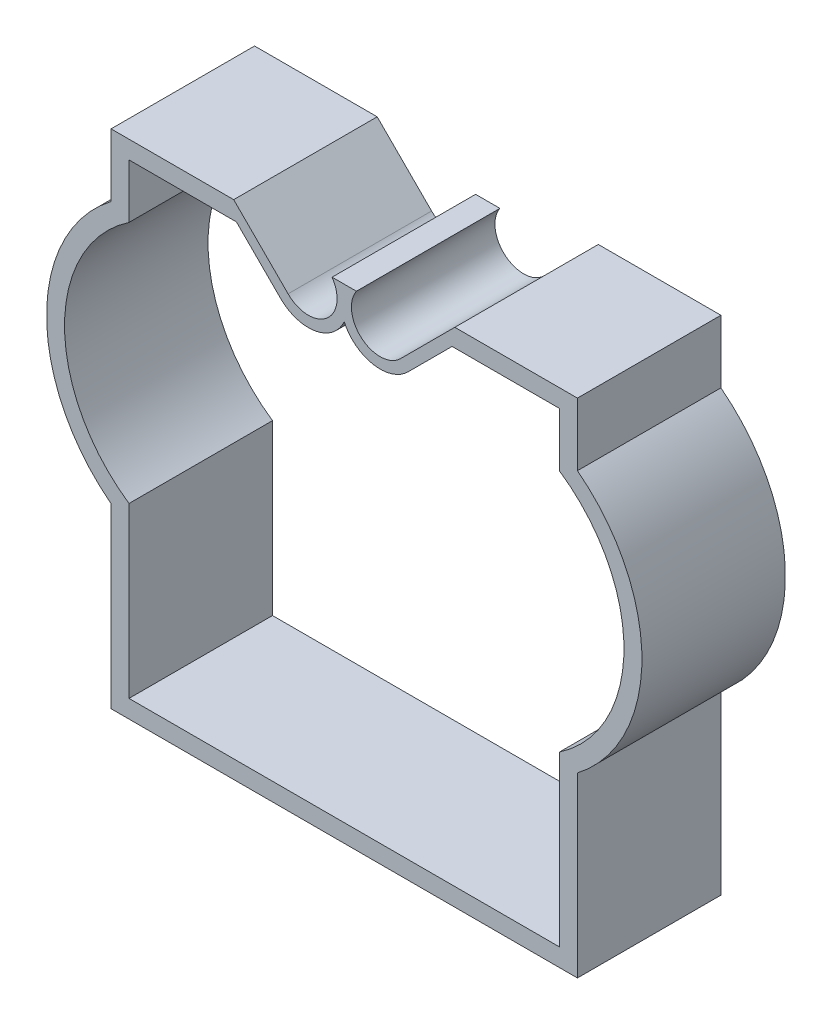
ISO-10303-21;
HEADER;
FILE_DESCRIPTION(('STEP AP214'),'2;1');
FILE_NAME('part.step','',(''),(''),'','','');
FILE_SCHEMA(('AUTOMOTIVE_DESIGN { 1 0 10303 214 1 1 1 1 }'));
ENDSEC;
DATA;
#1=APPLICATION_CONTEXT('core data for automotive mechanical design processes');
#2=APPLICATION_PROTOCOL_DEFINITION('international standard','automotive_design',2000,#1);
#3=PRODUCT_CONTEXT('',#1,'mechanical');
#4=PRODUCT('Part','Part','',(#3));
#5=PRODUCT_RELATED_PRODUCT_CATEGORY('part','',(#4));
#6=PRODUCT_DEFINITION_FORMATION('','',#4);
#7=PRODUCT_DEFINITION_CONTEXT('part definition',#1,'design');
#8=PRODUCT_DEFINITION('design','',#6,#7);
#9=PRODUCT_DEFINITION_SHAPE('','',#8);
#10=(LENGTH_UNIT() NAMED_UNIT(*) SI_UNIT(.MILLI.,.METRE.));
#11=(NAMED_UNIT(*) PLANE_ANGLE_UNIT() SI_UNIT($,.RADIAN.));
#12=(NAMED_UNIT(*) SI_UNIT($,.STERADIAN.) SOLID_ANGLE_UNIT());
#13=UNCERTAINTY_MEASURE_WITH_UNIT(LENGTH_MEASURE(1.E-05),#10,'distance_accuracy_value','');
#14=(GEOMETRIC_REPRESENTATION_CONTEXT(3) GLOBAL_UNCERTAINTY_ASSIGNED_CONTEXT((#13)) GLOBAL_UNIT_ASSIGNED_CONTEXT((#10,
#11,#12)) REPRESENTATION_CONTEXT('',''));
#15=CARTESIAN_POINT('',(0.,0.,0.));
#16=DIRECTION('',(0.,0.,1.));
#17=DIRECTION('',(1.,0.,0.));
#18=AXIS2_PLACEMENT_3D('',#15,#16,#17);
#19=CARTESIAN_POINT('',(0.,32.5,20.));
#20=DIRECTION('',(0.,1.,0.));
#21=DIRECTION('',(-1.,0.,0.));
#22=AXIS2_PLACEMENT_3D('',#19,#20,#21);
#23=PLANE('',#22);
#24=DIRECTION('',(1.,0.,0.));
#25=VECTOR('',#24,1.);
#26=CARTESIAN_POINT('',(0.,32.5,0.));
#27=LINE('',#26,#25);
#28=CARTESIAN_POINT('',(15.0311058469958,32.5,0.));
#29=VERTEX_POINT('',#28);
#30=CARTESIAN_POINT('',(30.,32.5,0.));
#31=VERTEX_POINT('',#30);
#32=EDGE_CURVE('E293',#29,#31,#27,.T.);
#33=ORIENTED_EDGE('',*,*,#32,.T.);
#34=DIRECTION('',(0.,0.,-1.));
#35=VECTOR('',#34,1.);
#36=CARTESIAN_POINT('',(30.,32.5,20.));
#37=LINE('',#36,#35);
#38=CARTESIAN_POINT('',(30.,32.5,20.));
#39=VERTEX_POINT('',#38);
#40=EDGE_CURVE('E11',#39,#31,#37,.T.);
#41=ORIENTED_EDGE('',*,*,#40,.F.);
#42=DIRECTION('',(1.,0.,0.));
#43=VECTOR('',#42,1.);
#44=CARTESIAN_POINT('',(0.,32.5,20.));
#45=LINE('',#44,#43);
#46=CARTESIAN_POINT('',(15.0311058469958,32.5,20.));
#47=VERTEX_POINT('',#46);
#48=EDGE_CURVE('E465',#47,#39,#45,.T.);
#49=ORIENTED_EDGE('',*,*,#48,.F.);
#50=DIRECTION('',(0.,0.,-1.));
#51=VECTOR('',#50,1.);
#52=CARTESIAN_POINT('',(15.0311058469958,32.5,20.));
#53=LINE('',#52,#51);
#54=EDGE_CURVE('E60',#47,#29,#53,.T.);
#55=ORIENTED_EDGE('',*,*,#54,.T.);
#56=EDGE_LOOP('',(#33,#41,#49,#55));
#57=FACE_BOUND('',#56,.T.);
#58=ADVANCED_FACE('F41',(#57),#23,.F.);
#59=CARTESIAN_POINT('',(30.,0.,20.));
#60=DIRECTION('',(-1.,0.,0.));
#61=DIRECTION('',(0.,0.,1.));
#62=AXIS2_PLACEMENT_3D('',#59,#60,#61);
#63=PLANE('',#62);
#64=DIRECTION('',(0.,1.,0.));
#65=VECTOR('',#64,1.);
#66=CARTESIAN_POINT('',(30.,0.,0.));
#67=LINE('',#66,#65);
#68=CARTESIAN_POINT('',(30.,24.9556725350294,0.));
#69=VERTEX_POINT('',#68);
#70=EDGE_CURVE('E295',#69,#31,#67,.T.);
#71=ORIENTED_EDGE('',*,*,#70,.F.);
#72=DIRECTION('',(0.,0.,-1.));
#73=VECTOR('',#72,1.);
#74=CARTESIAN_POINT('',(30.,24.9556725350294,20.));
#75=LINE('',#74,#73);
#76=CARTESIAN_POINT('',(30.,24.9556725350294,20.));
#77=VERTEX_POINT('',#76);
#78=EDGE_CURVE('E51',#77,#69,#75,.T.);
#79=ORIENTED_EDGE('',*,*,#78,.F.);
#80=DIRECTION('',(0.,1.,0.));
#81=VECTOR('',#80,1.);
#82=CARTESIAN_POINT('',(30.,0.,20.));
#83=LINE('',#82,#81);
#84=EDGE_CURVE('E467',#77,#39,#83,.T.);
#85=ORIENTED_EDGE('',*,*,#84,.T.);
#86=ORIENTED_EDGE('',*,*,#40,.T.);
#87=EDGE_LOOP('',(#71,#79,#85,#86));
#88=FACE_BOUND('',#87,.T.);
#89=ADVANCED_FACE('F510',(#88),#63,.T.);
#90=CARTESIAN_POINT('',(18.4883504422699,7.99300987672063,20.));
#91=DIRECTION('',(0.,0.,-1.));
#92=DIRECTION('',(-1.,0.,0.));
#93=AXIS2_PLACEMENT_3D('',#90,#91,#92);
#94=CYLINDRICAL_SURFACE('',#93,20.4999999999895);
#95=CARTESIAN_POINT('',(18.4883504422699,7.99300987672063,0.));
#96=DIRECTION('',(0.,0.,1.));
#97=DIRECTION('',(1.,0.,0.));
#98=AXIS2_PLACEMENT_3D('',#95,#96,#97);
#99=CIRCLE('',#98,20.4999999999895);
#100=CARTESIAN_POINT('',(30.,-8.96965278158818,0.));
#101=VERTEX_POINT('',#100);
#102=EDGE_CURVE('E298',#69,#101,#99,.F.);
#103=ORIENTED_EDGE('',*,*,#102,.T.);
#104=DIRECTION('',(0.,0.,-1.));
#105=VECTOR('',#104,1.);
#106=CARTESIAN_POINT('',(30.,-8.96965278158818,20.));
#107=LINE('',#106,#105);
#108=CARTESIAN_POINT('',(30.,-8.96965278158818,20.));
#109=VERTEX_POINT('',#108);
#110=EDGE_CURVE('E343',#109,#101,#107,.T.);
#111=ORIENTED_EDGE('',*,*,#110,.F.);
#112=CARTESIAN_POINT('',(18.4883504422699,7.99300987672063,20.));
#113=DIRECTION('',(0.,0.,1.));
#114=DIRECTION('',(1.,0.,0.));
#115=AXIS2_PLACEMENT_3D('',#112,#113,#114);
#116=CIRCLE('',#115,20.4999999999895);
#117=EDGE_CURVE('E470',#77,#109,#116,.F.);
#118=ORIENTED_EDGE('',*,*,#117,.F.);
#119=ORIENTED_EDGE('',*,*,#78,.T.);
#120=EDGE_LOOP('',(#103,#111,#118,#119));
#121=FACE_BOUND('',#120,.T.);
#122=ADVANCED_FACE('F515',(#121),#94,.F.);
#123=CARTESIAN_POINT('',(30.,0.,20.));
#124=DIRECTION('',(-1.,0.,0.));
#125=DIRECTION('',(0.,0.,1.));
#126=AXIS2_PLACEMENT_3D('',#123,#124,#125);
#127=PLANE('',#126);
#128=DIRECTION('',(0.,1.,0.));
#129=VECTOR('',#128,1.);
#130=CARTESIAN_POINT('',(30.,0.,0.));
#131=LINE('',#130,#129);
#132=CARTESIAN_POINT('',(30.,-32.5,0.));
#133=VERTEX_POINT('',#132);
#134=EDGE_CURVE('E301',#133,#101,#131,.T.);
#135=ORIENTED_EDGE('',*,*,#134,.F.);
#136=DIRECTION('',(0.,0.,-1.));
#137=VECTOR('',#136,1.);
#138=CARTESIAN_POINT('',(30.,-32.5,20.));
#139=LINE('',#138,#137);
#140=CARTESIAN_POINT('',(30.,-32.5,20.));
#141=VERTEX_POINT('',#140);
#142=EDGE_CURVE('E341',#141,#133,#139,.T.);
#143=ORIENTED_EDGE('',*,*,#142,.F.);
#144=DIRECTION('',(0.,1.,0.));
#145=VECTOR('',#144,1.);
#146=CARTESIAN_POINT('',(30.,0.,20.));
#147=LINE('',#146,#145);
#148=EDGE_CURVE('E472',#141,#109,#147,.T.);
#149=ORIENTED_EDGE('',*,*,#148,.T.);
#150=ORIENTED_EDGE('',*,*,#110,.T.);
#151=EDGE_LOOP('',(#135,#143,#149,#150));
#152=FACE_BOUND('',#151,.T.);
#153=ADVANCED_FACE('F571',(#152),#127,.T.);
#154=CARTESIAN_POINT('',(0.,-32.5,20.));
#155=DIRECTION('',(0.,1.,0.));
#156=DIRECTION('',(0.,0.,1.));
#157=AXIS2_PLACEMENT_3D('',#154,#155,#156);
#158=PLANE('',#157);
#159=DIRECTION('',(1.,0.,0.));
#160=VECTOR('',#159,1.);
#161=CARTESIAN_POINT('',(0.,-32.5,0.));
#162=LINE('',#161,#160);
#163=CARTESIAN_POINT('',(-30.,-32.5,0.));
#164=VERTEX_POINT('',#163);
#165=EDGE_CURVE('E304',#164,#133,#162,.T.);
#166=ORIENTED_EDGE('',*,*,#165,.F.);
#167=DIRECTION('',(0.,0.,-1.));
#168=VECTOR('',#167,1.);
#169=CARTESIAN_POINT('',(-30.,-32.5,20.));
#170=LINE('',#169,#168);
#171=CARTESIAN_POINT('',(-30.,-32.5,20.));
#172=VERTEX_POINT('',#171);
#173=EDGE_CURVE('E339',#172,#164,#170,.T.);
#174=ORIENTED_EDGE('',*,*,#173,.F.);
#175=DIRECTION('',(1.,0.,0.));
#176=VECTOR('',#175,1.);
#177=CARTESIAN_POINT('',(0.,-32.5,20.));
#178=LINE('',#177,#176);
#179=EDGE_CURVE('E475',#172,#141,#178,.T.);
#180=ORIENTED_EDGE('',*,*,#179,.T.);
#181=ORIENTED_EDGE('',*,*,#142,.T.);
#182=EDGE_LOOP('',(#166,#174,#180,#181));
#183=FACE_BOUND('',#182,.T.);
#184=ADVANCED_FACE('F567',(#183),#158,.T.);
#185=CARTESIAN_POINT('',(-30.,0.,20.));
#186=DIRECTION('',(-1.,0.,0.));
#187=DIRECTION('',(0.,0.,1.));
#188=AXIS2_PLACEMENT_3D('',#185,#186,#187);
#189=PLANE('',#188);
#190=DIRECTION('',(0.,1.,0.));
#191=VECTOR('',#190,1.);
#192=CARTESIAN_POINT('',(-30.,0.,0.));
#193=LINE('',#192,#191);
#194=CARTESIAN_POINT('',(-30.,-8.96965278158818,0.));
#195=VERTEX_POINT('',#194);
#196=EDGE_CURVE('E307',#164,#195,#193,.T.);
#197=ORIENTED_EDGE('',*,*,#196,.T.);
#198=DIRECTION('',(0.,0.,-1.));
#199=VECTOR('',#198,1.);
#200=CARTESIAN_POINT('',(-30.,-8.96965278158818,20.));
#201=LINE('',#200,#199);
#202=CARTESIAN_POINT('',(-30.,-8.96965278158818,20.));
#203=VERTEX_POINT('',#202);
#204=EDGE_CURVE('E337',#203,#195,#201,.T.);
#205=ORIENTED_EDGE('',*,*,#204,.F.);
#206=DIRECTION('',(0.,1.,0.));
#207=VECTOR('',#206,1.);
#208=CARTESIAN_POINT('',(-30.,0.,20.));
#209=LINE('',#208,#207);
#210=EDGE_CURVE('E478',#172,#203,#209,.T.);
#211=ORIENTED_EDGE('',*,*,#210,.F.);
#212=ORIENTED_EDGE('',*,*,#173,.T.);
#213=EDGE_LOOP('',(#197,#205,#211,#212));
#214=FACE_BOUND('',#213,.T.);
#215=ADVANCED_FACE('F563',(#214),#189,.F.);
#216=CARTESIAN_POINT('',(-18.4883504422699,7.99300987672063,20.));
#217=DIRECTION('',(0.,0.,-1.));
#218=DIRECTION('',(-1.,0.,0.));
#219=AXIS2_PLACEMENT_3D('',#216,#217,#218);
#220=CYLINDRICAL_SURFACE('',#219,20.4999999999895);
#221=CARTESIAN_POINT('',(-18.4883504422699,7.99300987672063,0.));
#222=DIRECTION('',(0.,0.,1.));
#223=DIRECTION('',(1.,0.,0.));
#224=AXIS2_PLACEMENT_3D('',#221,#222,#223);
#225=CIRCLE('',#224,20.4999999999895);
#226=CARTESIAN_POINT('',(-30.,24.9556725350294,0.));
#227=VERTEX_POINT('',#226);
#228=EDGE_CURVE('E310',#227,#195,#225,.T.);
#229=ORIENTED_EDGE('',*,*,#228,.F.);
#230=DIRECTION('',(0.,0.,-1.));
#231=VECTOR('',#230,1.);
#232=CARTESIAN_POINT('',(-30.,24.9556725350294,20.));
#233=LINE('',#232,#231);
#234=CARTESIAN_POINT('',(-30.,24.9556725350294,20.));
#235=VERTEX_POINT('',#234);
#236=EDGE_CURVE('E335',#235,#227,#233,.T.);
#237=ORIENTED_EDGE('',*,*,#236,.F.);
#238=CARTESIAN_POINT('',(-18.4883504422699,7.99300987672063,20.));
#239=DIRECTION('',(0.,0.,1.));
#240=DIRECTION('',(1.,0.,0.));
#241=AXIS2_PLACEMENT_3D('',#238,#239,#240);
#242=CIRCLE('',#241,20.4999999999895);
#243=EDGE_CURVE('E480',#235,#203,#242,.T.);
#244=ORIENTED_EDGE('',*,*,#243,.T.);
#245=ORIENTED_EDGE('',*,*,#204,.T.);
#246=EDGE_LOOP('',(#229,#237,#244,#245));
#247=FACE_BOUND('',#246,.T.);
#248=ADVANCED_FACE('F559',(#247),#220,.F.);
#249=CARTESIAN_POINT('',(-30.,0.,20.));
#250=DIRECTION('',(-1.,0.,0.));
#251=DIRECTION('',(0.,0.,1.));
#252=AXIS2_PLACEMENT_3D('',#249,#250,#251);
#253=PLANE('',#252);
#254=DIRECTION('',(0.,1.,0.));
#255=VECTOR('',#254,1.);
#256=CARTESIAN_POINT('',(-30.,0.,0.));
#257=LINE('',#256,#255);
#258=CARTESIAN_POINT('',(-30.,32.5,0.));
#259=VERTEX_POINT('',#258);
#260=EDGE_CURVE('E313',#227,#259,#257,.T.);
#261=ORIENTED_EDGE('',*,*,#260,.T.);
#262=DIRECTION('',(0.,0.,-1.));
#263=VECTOR('',#262,1.);
#264=CARTESIAN_POINT('',(-30.,32.5,20.));
#265=LINE('',#264,#263);
#266=CARTESIAN_POINT('',(-30.,32.5,20.));
#267=VERTEX_POINT('',#266);
#268=EDGE_CURVE('E332',#267,#259,#265,.T.);
#269=ORIENTED_EDGE('',*,*,#268,.F.);
#270=DIRECTION('',(0.,1.,0.));
#271=VECTOR('',#270,1.);
#272=CARTESIAN_POINT('',(-30.,0.,20.));
#273=LINE('',#272,#271);
#274=EDGE_CURVE('E483',#235,#267,#273,.T.);
#275=ORIENTED_EDGE('',*,*,#274,.F.);
#276=ORIENTED_EDGE('',*,*,#236,.T.);
#277=EDGE_LOOP('',(#261,#269,#275,#276));
#278=FACE_BOUND('',#277,.T.);
#279=ADVANCED_FACE('F556',(#278),#253,.F.);
#280=CARTESIAN_POINT('',(0.,32.4999999999999,20.));
#281=DIRECTION('',(0.,1.,0.));
#282=DIRECTION('',(-1.,0.,0.));
#283=AXIS2_PLACEMENT_3D('',#280,#281,#282);
#284=PLANE('',#283);
#285=DIRECTION('',(1.,0.,0.));
#286=VECTOR('',#285,1.);
#287=CARTESIAN_POINT('',(0.,32.4999999999999,0.));
#288=LINE('',#287,#286);
#289=CARTESIAN_POINT('',(-15.0311058469958,32.5,0.));
#290=VERTEX_POINT('',#289);
#291=EDGE_CURVE('E315',#259,#290,#288,.T.);
#292=ORIENTED_EDGE('',*,*,#291,.T.);
#293=DIRECTION('',(0.,0.,-1.));
#294=VECTOR('',#293,1.);
#295=CARTESIAN_POINT('',(-15.0311058469958,32.5,20.));
#296=LINE('',#295,#294);
#297=CARTESIAN_POINT('',(-15.0311058469958,32.5,20.));
#298=VERTEX_POINT('',#297);
#299=EDGE_CURVE('E329',#298,#290,#296,.T.);
#300=ORIENTED_EDGE('',*,*,#299,.F.);
#301=DIRECTION('',(1.,0.,0.));
#302=VECTOR('',#301,1.);
#303=CARTESIAN_POINT('',(0.,32.4999999999999,20.));
#304=LINE('',#303,#302);
#305=EDGE_CURVE('E485',#267,#298,#304,.T.);
#306=ORIENTED_EDGE('',*,*,#305,.F.);
#307=ORIENTED_EDGE('',*,*,#268,.T.);
#308=EDGE_LOOP('',(#292,#300,#306,#307));
#309=FACE_BOUND('',#308,.T.);
#310=ADVANCED_FACE('F492',(#309),#284,.F.);
#311=CARTESIAN_POINT('',(8.73444707650219,8.73444707650234,20.));
#312=DIRECTION('',(0.707106781186542,0.707106781186553,0.));
#313=DIRECTION('',(-0.707106781186553,0.707106781186542,0.));
#314=AXIS2_PLACEMENT_3D('',#311,#312,#313);
#315=PLANE('',#314);
#316=DIRECTION('',(0.707106781186553,-0.707106781186542,0.));
#317=VECTOR('',#316,1.);
#318=CARTESIAN_POINT('',(8.73444707650219,8.73444707650234,0.));
#319=LINE('',#318,#317);
#320=CARTESIAN_POINT('',(-8.88921644471966,26.3581105977239,0.));
#321=VERTEX_POINT('',#320);
#322=EDGE_CURVE('E317',#290,#321,#319,.T.);
#323=ORIENTED_EDGE('',*,*,#322,.T.);
#324=DIRECTION('',(0.,0.,-1.));
#325=VECTOR('',#324,1.);
#326=CARTESIAN_POINT('',(-8.88921644471966,26.3581105977239,20.));
#327=LINE('',#326,#325);
#328=CARTESIAN_POINT('',(-8.88921644471966,26.3581105977239,20.));
#329=VERTEX_POINT('',#328);
#330=EDGE_CURVE('E246',#329,#321,#327,.T.);
#331=ORIENTED_EDGE('',*,*,#330,.F.);
#332=DIRECTION('',(0.707106781186553,-0.707106781186542,0.));
#333=VECTOR('',#332,1.);
#334=CARTESIAN_POINT('',(8.73444707650219,8.73444707650234,20.));
#335=LINE('',#334,#333);
#336=EDGE_CURVE('E234',#298,#329,#335,.T.);
#337=ORIENTED_EDGE('',*,*,#336,.F.);
#338=ORIENTED_EDGE('',*,*,#299,.T.);
#339=EDGE_LOOP('',(#323,#331,#337,#338));
#340=FACE_BOUND('',#339,.T.);
#341=ADVANCED_FACE('F496',(#340),#315,.F.);
#342=CARTESIAN_POINT('',(-5.00012914820205,30.2471978942416,20.));
#343=DIRECTION('',(0.,0.,-1.));
#344=DIRECTION('',(-1.,0.,0.));
#345=AXIS2_PLACEMENT_3D('',#342,#343,#344);
#346=CYLINDRICAL_SURFACE('',#345,5.49999999998816);
#347=CARTESIAN_POINT('',(-5.00012914820205,30.2471978942416,0.));
#348=DIRECTION('',(0.,0.,1.));
#349=DIRECTION('',(1.,0.,0.));
#350=AXIS2_PLACEMENT_3D('',#347,#348,#349);
#351=CIRCLE('',#350,5.49999999998816);
#352=CARTESIAN_POINT('',(0.,27.9561918922481,0.));
#353=VERTEX_POINT('',#352);
#354=EDGE_CURVE('E243',#321,#353,#351,.T.);
#355=ORIENTED_EDGE('',*,*,#354,.T.);
#356=DIRECTION('',(0.,0.,-1.));
#357=VECTOR('',#356,1.);
#358=CARTESIAN_POINT('',(0.,27.9561918922481,20.));
#359=LINE('',#358,#357);
#360=CARTESIAN_POINT('',(0.,27.9561918922481,20.));
#361=VERTEX_POINT('',#360);
#362=EDGE_CURVE('E240',#361,#353,#359,.T.);
#363=ORIENTED_EDGE('',*,*,#362,.F.);
#364=CARTESIAN_POINT('',(-5.00012914820205,30.2471978942416,20.));
#365=DIRECTION('',(0.,0.,1.));
#366=DIRECTION('',(1.,0.,0.));
#367=AXIS2_PLACEMENT_3D('',#364,#365,#366);
#368=CIRCLE('',#367,5.49999999998816);
#369=EDGE_CURVE('E227',#329,#361,#368,.T.);
#370=ORIENTED_EDGE('',*,*,#369,.F.);
#371=ORIENTED_EDGE('',*,*,#330,.T.);
#372=EDGE_LOOP('',(#355,#363,#370,#371));
#373=FACE_BOUND('',#372,.T.);
#374=ADVANCED_FACE('F241',(#373),#346,.T.);
#375=CARTESIAN_POINT('',(5.00012914820205,30.2471978942416,20.));
#376=DIRECTION('',(0.,0.,-1.));
#377=DIRECTION('',(-1.,0.,0.));
#378=AXIS2_PLACEMENT_3D('',#375,#376,#377);
#379=CYLINDRICAL_SURFACE('',#378,5.49999999998816);
#380=CARTESIAN_POINT('',(5.00012914820205,30.2471978942416,0.));
#381=DIRECTION('',(0.,0.,1.));
#382=DIRECTION('',(1.,0.,0.));
#383=AXIS2_PLACEMENT_3D('',#380,#381,#382);
#384=CIRCLE('',#383,5.49999999998816);
#385=CARTESIAN_POINT('',(8.88921644471967,26.3581105977239,0.));
#386=VERTEX_POINT('',#385);
#387=EDGE_CURVE('E320',#386,#353,#384,.F.);
#388=ORIENTED_EDGE('',*,*,#387,.F.);
#389=DIRECTION('',(0.,0.,-1.));
#390=VECTOR('',#389,1.);
#391=CARTESIAN_POINT('',(8.88921644471967,26.3581105977239,20.));
#392=LINE('',#391,#390);
#393=CARTESIAN_POINT('',(8.88921644471967,26.3581105977239,20.));
#394=VERTEX_POINT('',#393);
#395=EDGE_CURVE('E142',#394,#386,#392,.T.);
#396=ORIENTED_EDGE('',*,*,#395,.F.);
#397=CARTESIAN_POINT('',(5.00012914820205,30.2471978942416,20.));
#398=DIRECTION('',(0.,0.,1.));
#399=DIRECTION('',(1.,0.,0.));
#400=AXIS2_PLACEMENT_3D('',#397,#398,#399);
#401=CIRCLE('',#400,5.49999999998816);
#402=EDGE_CURVE('E232',#394,#361,#401,.F.);
#403=ORIENTED_EDGE('',*,*,#402,.T.);
#404=ORIENTED_EDGE('',*,*,#362,.T.);
#405=EDGE_LOOP('',(#388,#396,#403,#404));
#406=FACE_BOUND('',#405,.T.);
#407=ADVANCED_FACE('F248',(#406),#379,.T.);
#408=CARTESIAN_POINT('',(18.4883504422699,7.99300987672063,20.));
#409=DIRECTION('',(0.,0.,-1.));
#410=DIRECTION('',(-1.,0.,0.));
#411=AXIS2_PLACEMENT_3D('',#408,#409,#410);
#412=CYLINDRICAL_SURFACE('',#411,23.);
#413=CARTESIAN_POINT('',(18.4883504422699,7.99300987672063,0.));
#414=DIRECTION('',(0.,0.,1.));
#415=DIRECTION('',(1.,0.,0.));
#416=AXIS2_PLACEMENT_3D('',#413,#414,#415);
#417=CIRCLE('',#416,23.);
#418=CARTESIAN_POINT('',(32.5,26.2323540719312,0.));
#419=VERTEX_POINT('',#418);
#420=CARTESIAN_POINT('',(32.5,-10.24633431849,0.));
#421=VERTEX_POINT('',#420);
#422=EDGE_CURVE('E255',#419,#421,#417,.F.);
#423=ORIENTED_EDGE('',*,*,#422,.F.);
#424=DIRECTION('',(0.,0.,-1.));
#425=VECTOR('',#424,1.);
#426=CARTESIAN_POINT('',(32.5,26.2323540719312,20.));
#427=LINE('',#426,#425);
#428=CARTESIAN_POINT('',(32.5,26.2323540719312,20.));
#429=VERTEX_POINT('',#428);
#430=EDGE_CURVE('E45',#429,#419,#427,.T.);
#431=ORIENTED_EDGE('',*,*,#430,.F.);
#432=CARTESIAN_POINT('',(18.4883504422699,7.99300987672063,20.));
#433=DIRECTION('',(0.,0.,1.));
#434=DIRECTION('',(1.,0.,0.));
#435=AXIS2_PLACEMENT_3D('',#432,#433,#434);
#436=CIRCLE('',#435,23.);
#437=CARTESIAN_POINT('',(32.5,-10.24633431849,20.));
#438=VERTEX_POINT('',#437);
#439=EDGE_CURVE('E325',#429,#438,#436,.F.);
#440=ORIENTED_EDGE('',*,*,#439,.T.);
#441=DIRECTION('',(0.,0.,-1.));
#442=VECTOR('',#441,1.);
#443=CARTESIAN_POINT('',(32.5,-10.24633431849,20.));
#444=LINE('',#443,#442);
#445=EDGE_CURVE('E251',#438,#421,#444,.T.);
#446=ORIENTED_EDGE('',*,*,#445,.T.);
#447=EDGE_LOOP('',(#423,#431,#440,#446));
#448=FACE_BOUND('',#447,.T.);
#449=ADVANCED_FACE('F43',(#448),#412,.T.);
#450=CARTESIAN_POINT('',(32.5,0.,20.));
#451=DIRECTION('',(-1.,0.,0.));
#452=DIRECTION('',(0.,0.,1.));
#453=AXIS2_PLACEMENT_3D('',#450,#451,#452);
#454=PLANE('',#453);
#455=DIRECTION('',(0.,1.,0.));
#456=VECTOR('',#455,1.);
#457=CARTESIAN_POINT('',(32.5,0.,0.));
#458=LINE('',#457,#456);
#459=CARTESIAN_POINT('',(32.5,35.,0.));
#460=VERTEX_POINT('',#459);
#461=EDGE_CURVE('E258',#419,#460,#458,.T.);
#462=ORIENTED_EDGE('',*,*,#461,.T.);
#463=DIRECTION('',(0.,0.,-1.));
#464=VECTOR('',#463,1.);
#465=CARTESIAN_POINT('',(32.5,35.,20.));
#466=LINE('',#465,#464);
#467=CARTESIAN_POINT('',(32.5,35.,20.));
#468=VERTEX_POINT('',#467);
#469=EDGE_CURVE('E370',#468,#460,#466,.T.);
#470=ORIENTED_EDGE('',*,*,#469,.F.);
#471=DIRECTION('',(0.,1.,0.));
#472=VECTOR('',#471,1.);
#473=CARTESIAN_POINT('',(32.5,0.,20.));
#474=LINE('',#473,#472);
#475=EDGE_CURVE('E378',#429,#468,#474,.T.);
#476=ORIENTED_EDGE('',*,*,#475,.F.);
#477=ORIENTED_EDGE('',*,*,#430,.T.);
#478=EDGE_LOOP('',(#462,#470,#476,#477));
#479=FACE_BOUND('',#478,.T.);
#480=ADVANCED_FACE('F377',(#479),#454,.F.);
#481=CARTESIAN_POINT('',(0.,35.,20.));
#482=DIRECTION('',(0.,1.,0.));
#483=DIRECTION('',(0.,0.,1.));
#484=AXIS2_PLACEMENT_3D('',#481,#482,#483);
#485=PLANE('',#484);
#486=DIRECTION('',(1.,0.,0.));
#487=VECTOR('',#486,1.);
#488=CARTESIAN_POINT('',(0.,35.,0.));
#489=LINE('',#488,#487);
#490=CARTESIAN_POINT('',(15.4097855034529,35.,0.));
#491=VERTEX_POINT('',#490);
#492=EDGE_CURVE('E261',#491,#460,#489,.T.);
#493=ORIENTED_EDGE('',*,*,#492,.F.);
#494=DIRECTION('',(0.,0.,-1.));
#495=VECTOR('',#494,1.);
#496=CARTESIAN_POINT('',(15.4097855034529,35.,20.));
#497=LINE('',#496,#495);
#498=CARTESIAN_POINT('',(15.4097855034529,35.,20.));
#499=VERTEX_POINT('',#498);
#500=EDGE_CURVE('E369',#499,#491,#497,.T.);
#501=ORIENTED_EDGE('',*,*,#500,.F.);
#502=DIRECTION('',(1.,0.,0.));
#503=VECTOR('',#502,1.);
#504=CARTESIAN_POINT('',(0.,35.,20.));
#505=LINE('',#504,#503);
#506=EDGE_CURVE('E446',#499,#468,#505,.T.);
#507=ORIENTED_EDGE('',*,*,#506,.T.);
#508=ORIENTED_EDGE('',*,*,#469,.T.);
#509=EDGE_LOOP('',(#493,#501,#507,#508));
#510=FACE_BOUND('',#509,.T.);
#511=ADVANCED_FACE('F445',(#510),#485,.T.);
#512=CARTESIAN_POINT('',(-9.79510724827356,9.79510724827356,20.));
#513=DIRECTION('',(0.707106781186548,-0.707106781186548,0.));
#514=DIRECTION('',(0.707106781186548,0.707106781186548,0.));
#515=AXIS2_PLACEMENT_3D('',#512,#513,#514);
#516=PLANE('',#515);
#517=DIRECTION('',(-0.707106781186548,-0.707106781186548,0.));
#518=VECTOR('',#517,1.);
#519=CARTESIAN_POINT('',(-9.79510724827356,9.79510724827356,0.));
#520=LINE('',#519,#518);
#521=CARTESIAN_POINT('',(7.82855627294825,27.4187707694954,0.));
#522=VERTEX_POINT('',#521);
#523=EDGE_CURVE('E264',#491,#522,#520,.T.);
#524=ORIENTED_EDGE('',*,*,#523,.T.);
#525=DIRECTION('',(0.,0.,-1.));
#526=VECTOR('',#525,1.);
#527=CARTESIAN_POINT('',(7.82855627294825,27.4187707694954,20.));
#528=LINE('',#527,#526);
#529=CARTESIAN_POINT('',(7.82855627294825,27.4187707694954,20.));
#530=VERTEX_POINT('',#529);
#531=EDGE_CURVE('E366',#530,#522,#528,.T.);
#532=ORIENTED_EDGE('',*,*,#531,.F.);
#533=DIRECTION('',(-0.707106781186548,-0.707106781186548,0.));
#534=VECTOR('',#533,1.);
#535=CARTESIAN_POINT('',(-9.79510724827356,9.79510724827356,20.));
#536=LINE('',#535,#534);
#537=EDGE_CURVE('E443',#499,#530,#536,.T.);
#538=ORIENTED_EDGE('',*,*,#537,.F.);
#539=ORIENTED_EDGE('',*,*,#500,.T.);
#540=EDGE_LOOP('',(#524,#532,#538,#539));
#541=FACE_BOUND('',#540,.T.);
#542=ADVANCED_FACE('F442',(#541),#516,.F.);
#543=CARTESIAN_POINT('',(5.00012914820205,30.2471978942416,20.));
#544=DIRECTION('',(0.,0.,-1.));
#545=DIRECTION('',(-1.,0.,0.));
#546=AXIS2_PLACEMENT_3D('',#543,#544,#545);
#547=CYLINDRICAL_SURFACE('',#546,3.99999999998816);
#548=CARTESIAN_POINT('',(5.00012914820205,30.2471978942416,0.));
#549=DIRECTION('',(0.,0.,1.));
#550=DIRECTION('',(1.,0.,0.));
#551=AXIS2_PLACEMENT_3D('',#548,#549,#550);
#552=CIRCLE('',#551,3.99999999998816);
#553=CARTESIAN_POINT('',(1.69484812048357,32.5,0.));
#554=VERTEX_POINT('',#553);
#555=EDGE_CURVE('E267',#522,#554,#552,.F.);
#556=ORIENTED_EDGE('',*,*,#555,.T.);
#557=DIRECTION('',(0.,0.,-1.));
#558=VECTOR('',#557,1.);
#559=CARTESIAN_POINT('',(1.69484812048357,32.5,20.));
#560=LINE('',#559,#558);
#561=CARTESIAN_POINT('',(1.69484812048357,32.5,20.));
#562=VERTEX_POINT('',#561);
#563=EDGE_CURVE('E364',#562,#554,#560,.T.);
#564=ORIENTED_EDGE('',*,*,#563,.F.);
#565=CARTESIAN_POINT('',(5.00012914820205,30.2471978942416,20.));
#566=DIRECTION('',(0.,0.,1.));
#567=DIRECTION('',(1.,0.,0.));
#568=AXIS2_PLACEMENT_3D('',#565,#566,#567);
#569=CIRCLE('',#568,3.99999999998816);
#570=EDGE_CURVE('E439',#530,#562,#569,.F.);
#571=ORIENTED_EDGE('',*,*,#570,.F.);
#572=ORIENTED_EDGE('',*,*,#531,.T.);
#573=EDGE_LOOP('',(#556,#564,#571,#572));
#574=FACE_BOUND('',#573,.T.);
#575=ADVANCED_FACE('F436',(#574),#547,.F.);
#576=CARTESIAN_POINT('',(0.,32.5,20.));
#577=DIRECTION('',(0.,1.,0.));
#578=DIRECTION('',(-1.,0.,0.));
#579=AXIS2_PLACEMENT_3D('',#576,#577,#578);
#580=PLANE('',#579);
#581=DIRECTION('',(1.,0.,0.));
#582=VECTOR('',#581,1.);
#583=CARTESIAN_POINT('',(0.,32.5,0.));
#584=LINE('',#583,#582);
#585=CARTESIAN_POINT('',(-1.69484812048357,32.5,0.));
#586=VERTEX_POINT('',#585);
#587=EDGE_CURVE('E270',#586,#554,#584,.T.);
#588=ORIENTED_EDGE('',*,*,#587,.F.);
#589=DIRECTION('',(0.,0.,-1.));
#590=VECTOR('',#589,1.);
#591=CARTESIAN_POINT('',(-1.69484812048357,32.5,20.));
#592=LINE('',#591,#590);
#593=CARTESIAN_POINT('',(-1.69484812048357,32.5,20.));
#594=VERTEX_POINT('',#593);
#595=EDGE_CURVE('E362',#594,#586,#592,.T.);
#596=ORIENTED_EDGE('',*,*,#595,.F.);
#597=DIRECTION('',(1.,0.,0.));
#598=VECTOR('',#597,1.);
#599=CARTESIAN_POINT('',(0.,32.5,20.));
#600=LINE('',#599,#598);
#601=EDGE_CURVE('E455',#594,#562,#600,.T.);
#602=ORIENTED_EDGE('',*,*,#601,.T.);
#603=ORIENTED_EDGE('',*,*,#563,.T.);
#604=EDGE_LOOP('',(#588,#596,#602,#603));
#605=FACE_BOUND('',#604,.T.);
#606=ADVANCED_FACE('F432',(#605),#580,.T.);
#607=CARTESIAN_POINT('',(-5.00012914820205,30.2471978942416,20.));
#608=DIRECTION('',(0.,0.,-1.));
#609=DIRECTION('',(-1.,0.,0.));
#610=AXIS2_PLACEMENT_3D('',#607,#608,#609);
#611=CYLINDRICAL_SURFACE('',#610,3.99999999998816);
#612=CARTESIAN_POINT('',(-5.00012914820205,30.2471978942416,0.));
#613=DIRECTION('',(0.,0.,1.));
#614=DIRECTION('',(1.,0.,0.));
#615=AXIS2_PLACEMENT_3D('',#612,#613,#614);
#616=CIRCLE('',#615,3.99999999998816);
#617=CARTESIAN_POINT('',(-7.82855627294822,27.4187707694954,0.));
#618=VERTEX_POINT('',#617);
#619=EDGE_CURVE('E273',#618,#586,#616,.T.);
#620=ORIENTED_EDGE('',*,*,#619,.F.);
#621=DIRECTION('',(0.,0.,-1.));
#622=VECTOR('',#621,1.);
#623=CARTESIAN_POINT('',(-7.82855627294822,27.4187707694954,20.));
#624=LINE('',#623,#622);
#625=CARTESIAN_POINT('',(-7.82855627294822,27.4187707694954,20.));
#626=VERTEX_POINT('',#625);
#627=EDGE_CURVE('E360',#626,#618,#624,.T.);
#628=ORIENTED_EDGE('',*,*,#627,.F.);
#629=CARTESIAN_POINT('',(-5.00012914820205,30.2471978942416,20.));
#630=DIRECTION('',(0.,0.,1.));
#631=DIRECTION('',(1.,0.,0.));
#632=AXIS2_PLACEMENT_3D('',#629,#630,#631);
#633=CIRCLE('',#632,3.99999999998816);
#634=EDGE_CURVE('E428',#626,#594,#633,.T.);
#635=ORIENTED_EDGE('',*,*,#634,.T.);
#636=ORIENTED_EDGE('',*,*,#595,.T.);
#637=EDGE_LOOP('',(#620,#628,#635,#636));
#638=FACE_BOUND('',#637,.T.);
#639=ADVANCED_FACE('F426',(#638),#611,.F.);
#640=CARTESIAN_POINT('',(9.79510724827363,9.79510724827378,20.));
#641=DIRECTION('',(0.707106781186542,0.707106781186553,0.));
#642=DIRECTION('',(-0.707106781186553,0.707106781186542,0.));
#643=AXIS2_PLACEMENT_3D('',#640,#641,#642);
#644=PLANE('',#643);
#645=DIRECTION('',(0.707106781186553,-0.707106781186542,0.));
#646=VECTOR('',#645,1.);
#647=CARTESIAN_POINT('',(9.79510724827363,9.79510724827378,0.));
#648=LINE('',#647,#646);
#649=CARTESIAN_POINT('',(-15.409785503453,35.,0.));
#650=VERTEX_POINT('',#649);
#651=EDGE_CURVE('E276',#650,#618,#648,.T.);
#652=ORIENTED_EDGE('',*,*,#651,.F.);
#653=DIRECTION('',(0.,0.,-1.));
#654=VECTOR('',#653,1.);
#655=CARTESIAN_POINT('',(-15.409785503453,35.,20.));
#656=LINE('',#655,#654);
#657=CARTESIAN_POINT('',(-15.409785503453,35.,20.));
#658=VERTEX_POINT('',#657);
#659=EDGE_CURVE('E358',#658,#650,#656,.T.);
#660=ORIENTED_EDGE('',*,*,#659,.F.);
#661=DIRECTION('',(0.707106781186553,-0.707106781186542,0.));
#662=VECTOR('',#661,1.);
#663=CARTESIAN_POINT('',(9.79510724827363,9.79510724827378,20.));
#664=LINE('',#663,#662);
#665=EDGE_CURVE('E422',#658,#626,#664,.T.);
#666=ORIENTED_EDGE('',*,*,#665,.T.);
#667=ORIENTED_EDGE('',*,*,#627,.T.);
#668=EDGE_LOOP('',(#652,#660,#666,#667));
#669=FACE_BOUND('',#668,.T.);
#670=ADVANCED_FACE('F419',(#669),#644,.T.);
#671=CARTESIAN_POINT('',(-32.5,35.,0.));
#672=VERTEX_POINT('',#671);
#673=EDGE_CURVE('E265',#672,#650,#489,.T.);
#674=ORIENTED_EDGE('',*,*,#673,.F.);
#675=DIRECTION('',(0.,0.,-1.));
#676=VECTOR('',#675,1.);
#677=CARTESIAN_POINT('',(-32.5,35.,20.));
#678=LINE('',#677,#676);
#679=CARTESIAN_POINT('',(-32.5,35.,20.));
#680=VERTEX_POINT('',#679);
#681=EDGE_CURVE('E356',#680,#672,#678,.T.);
#682=ORIENTED_EDGE('',*,*,#681,.F.);
#683=EDGE_CURVE('E449',#680,#658,#505,.T.);
#684=ORIENTED_EDGE('',*,*,#683,.T.);
#685=ORIENTED_EDGE('',*,*,#659,.T.);
#686=EDGE_LOOP('',(#674,#682,#684,#685));
#687=FACE_BOUND('',#686,.T.);
#688=ADVANCED_FACE('F415',(#687),#485,.T.);
#689=CARTESIAN_POINT('',(-32.5,0.,20.));
#690=DIRECTION('',(-1.,0.,0.));
#691=DIRECTION('',(0.,0.,1.));
#692=AXIS2_PLACEMENT_3D('',#689,#690,#691);
#693=PLANE('',#692);
#694=DIRECTION('',(0.,1.,0.));
#695=VECTOR('',#694,1.);
#696=CARTESIAN_POINT('',(-32.5,0.,0.));
#697=LINE('',#696,#695);
#698=CARTESIAN_POINT('',(-32.5,26.2323540719312,0.));
#699=VERTEX_POINT('',#698);
#700=EDGE_CURVE('E279',#699,#672,#697,.T.);
#701=ORIENTED_EDGE('',*,*,#700,.F.);
#702=DIRECTION('',(0.,0.,-1.));
#703=VECTOR('',#702,1.);
#704=CARTESIAN_POINT('',(-32.5,26.2323540719312,20.));
#705=LINE('',#704,#703);
#706=CARTESIAN_POINT('',(-32.5,26.2323540719312,20.));
#707=VERTEX_POINT('',#706);
#708=EDGE_CURVE('E354',#707,#699,#705,.T.);
#709=ORIENTED_EDGE('',*,*,#708,.F.);
#710=DIRECTION('',(0.,1.,0.));
#711=VECTOR('',#710,1.);
#712=CARTESIAN_POINT('',(-32.5,0.,20.));
#713=LINE('',#712,#711);
#714=EDGE_CURVE('E411',#707,#680,#713,.T.);
#715=ORIENTED_EDGE('',*,*,#714,.T.);
#716=ORIENTED_EDGE('',*,*,#681,.T.);
#717=EDGE_LOOP('',(#701,#709,#715,#716));
#718=FACE_BOUND('',#717,.T.);
#719=ADVANCED_FACE('F407',(#718),#693,.T.);
#720=CARTESIAN_POINT('',(-18.4883504422699,7.99300987672063,20.));
#721=DIRECTION('',(0.,0.,-1.));
#722=DIRECTION('',(-1.,0.,0.));
#723=AXIS2_PLACEMENT_3D('',#720,#721,#722);
#724=CYLINDRICAL_SURFACE('',#723,23.);
#725=CARTESIAN_POINT('',(-18.4883504422699,7.99300987672063,0.));
#726=DIRECTION('',(0.,0.,1.));
#727=DIRECTION('',(1.,0.,0.));
#728=AXIS2_PLACEMENT_3D('',#725,#726,#727);
#729=CIRCLE('',#728,23.);
#730=CARTESIAN_POINT('',(-32.5,-10.2463343184899,0.));
#731=VERTEX_POINT('',#730);
#732=EDGE_CURVE('E282',#699,#731,#729,.T.);
#733=ORIENTED_EDGE('',*,*,#732,.T.);
#734=DIRECTION('',(0.,0.,-1.));
#735=VECTOR('',#734,1.);
#736=CARTESIAN_POINT('',(-32.5,-10.2463343184899,20.));
#737=LINE('',#736,#735);
#738=CARTESIAN_POINT('',(-32.5,-10.2463343184899,20.));
#739=VERTEX_POINT('',#738);
#740=EDGE_CURVE('E352',#739,#731,#737,.T.);
#741=ORIENTED_EDGE('',*,*,#740,.F.);
#742=CARTESIAN_POINT('',(-18.4883504422699,7.99300987672063,20.));
#743=DIRECTION('',(0.,0.,1.));
#744=DIRECTION('',(1.,0.,0.));
#745=AXIS2_PLACEMENT_3D('',#742,#743,#744);
#746=CIRCLE('',#745,23.);
#747=EDGE_CURVE('E452',#707,#739,#746,.T.);
#748=ORIENTED_EDGE('',*,*,#747,.F.);
#749=ORIENTED_EDGE('',*,*,#708,.T.);
#750=EDGE_LOOP('',(#733,#741,#748,#749));
#751=FACE_BOUND('',#750,.T.);
#752=ADVANCED_FACE('F403',(#751),#724,.T.);
#753=CARTESIAN_POINT('',(-32.5,0.,20.));
#754=DIRECTION('',(-1.,0.,0.));
#755=DIRECTION('',(0.,0.,1.));
#756=AXIS2_PLACEMENT_3D('',#753,#754,#755);
#757=PLANE('',#756);
#758=DIRECTION('',(0.,1.,0.));
#759=VECTOR('',#758,1.);
#760=CARTESIAN_POINT('',(-32.5,0.,0.));
#761=LINE('',#760,#759);
#762=CARTESIAN_POINT('',(-32.5,-35.,0.));
#763=VERTEX_POINT('',#762);
#764=EDGE_CURVE('E285',#763,#731,#761,.T.);
#765=ORIENTED_EDGE('',*,*,#764,.F.);
#766=DIRECTION('',(0.,0.,-1.));
#767=VECTOR('',#766,1.);
#768=CARTESIAN_POINT('',(-32.5,-35.,20.));
#769=LINE('',#768,#767);
#770=CARTESIAN_POINT('',(-32.5,-35.,20.));
#771=VERTEX_POINT('',#770);
#772=EDGE_CURVE('E350',#771,#763,#769,.T.);
#773=ORIENTED_EDGE('',*,*,#772,.F.);
#774=DIRECTION('',(0.,1.,0.));
#775=VECTOR('',#774,1.);
#776=CARTESIAN_POINT('',(-32.5,0.,20.));
#777=LINE('',#776,#775);
#778=EDGE_CURVE('E400',#771,#739,#777,.T.);
#779=ORIENTED_EDGE('',*,*,#778,.T.);
#780=ORIENTED_EDGE('',*,*,#740,.T.);
#781=EDGE_LOOP('',(#765,#773,#779,#780));
#782=FACE_BOUND('',#781,.T.);
#783=ADVANCED_FACE('F395',(#782),#757,.T.);
#784=CARTESIAN_POINT('',(0.,-35.,20.));
#785=DIRECTION('',(0.,1.,0.));
#786=DIRECTION('',(0.,0.,1.));
#787=AXIS2_PLACEMENT_3D('',#784,#785,#786);
#788=PLANE('',#787);
#789=DIRECTION('',(1.,0.,0.));
#790=VECTOR('',#789,1.);
#791=CARTESIAN_POINT('',(0.,-35.,0.));
#792=LINE('',#791,#790);
#793=CARTESIAN_POINT('',(32.5,-35.,0.));
#794=VERTEX_POINT('',#793);
#795=EDGE_CURVE('E288',#763,#794,#792,.T.);
#796=ORIENTED_EDGE('',*,*,#795,.T.);
#797=DIRECTION('',(0.,0.,-1.));
#798=VECTOR('',#797,1.);
#799=CARTESIAN_POINT('',(32.5,-35.,20.));
#800=LINE('',#799,#798);
#801=CARTESIAN_POINT('',(32.5,-35.,20.));
#802=VERTEX_POINT('',#801);
#803=EDGE_CURVE('E347',#802,#794,#800,.T.);
#804=ORIENTED_EDGE('',*,*,#803,.F.);
#805=DIRECTION('',(1.,0.,0.));
#806=VECTOR('',#805,1.);
#807=CARTESIAN_POINT('',(0.,-35.,20.));
#808=LINE('',#807,#806);
#809=EDGE_CURVE('E461',#771,#802,#808,.T.);
#810=ORIENTED_EDGE('',*,*,#809,.F.);
#811=ORIENTED_EDGE('',*,*,#772,.T.);
#812=EDGE_LOOP('',(#796,#804,#810,#811));
#813=FACE_BOUND('',#812,.T.);
#814=ADVANCED_FACE('F505',(#813),#788,.F.);
#815=CARTESIAN_POINT('',(32.5,0.,20.));
#816=DIRECTION('',(-1.,0.,0.));
#817=DIRECTION('',(0.,0.,1.));
#818=AXIS2_PLACEMENT_3D('',#815,#816,#817);
#819=PLANE('',#818);
#820=DIRECTION('',(0.,1.,0.));
#821=VECTOR('',#820,1.);
#822=CARTESIAN_POINT('',(32.5,0.,0.));
#823=LINE('',#822,#821);
#824=EDGE_CURVE('E290',#794,#421,#823,.T.);
#825=ORIENTED_EDGE('',*,*,#824,.T.);
#826=ORIENTED_EDGE('',*,*,#445,.F.);
#827=DIRECTION('',(0.,1.,0.));
#828=VECTOR('',#827,1.);
#829=CARTESIAN_POINT('',(32.5,0.,20.));
#830=LINE('',#829,#828);
#831=EDGE_CURVE('E463',#802,#438,#830,.T.);
#832=ORIENTED_EDGE('',*,*,#831,.F.);
#833=ORIENTED_EDGE('',*,*,#803,.T.);
#834=EDGE_LOOP('',(#825,#826,#832,#833));
#835=FACE_BOUND('',#834,.T.);
#836=ADVANCED_FACE('F388',(#835),#819,.F.);
#837=CARTESIAN_POINT('',(-8.73444707650214,8.73444707650217,20.));
#838=DIRECTION('',(0.707106781186546,-0.707106781186549,0.));
#839=DIRECTION('',(0.707106781186549,0.707106781186546,0.));
#840=AXIS2_PLACEMENT_3D('',#837,#838,#839);
#841=PLANE('',#840);
#842=DIRECTION('',(-0.707106781186549,-0.707106781186546,0.));
#843=VECTOR('',#842,1.);
#844=CARTESIAN_POINT('',(-8.73444707650214,8.73444707650217,0.));
#845=LINE('',#844,#843);
#846=EDGE_CURVE('E322',#29,#386,#845,.T.);
#847=ORIENTED_EDGE('',*,*,#846,.F.);
#848=ORIENTED_EDGE('',*,*,#54,.F.);
#849=DIRECTION('',(-0.707106781186549,-0.707106781186546,0.));
#850=VECTOR('',#849,1.);
#851=CARTESIAN_POINT('',(-8.73444707650214,8.73444707650217,20.));
#852=LINE('',#851,#850);
#853=EDGE_CURVE('E249',#47,#394,#852,.T.);
#854=ORIENTED_EDGE('',*,*,#853,.T.);
#855=ORIENTED_EDGE('',*,*,#395,.T.);
#856=EDGE_LOOP('',(#847,#848,#854,#855));
#857=FACE_BOUND('',#856,.T.);
#858=ADVANCED_FACE('F497',(#857),#841,.T.);
#859=CARTESIAN_POINT('',(0.,0.,20.));
#860=DIRECTION('',(0.,0.,1.));
#861=DIRECTION('',(1.,0.,0.));
#862=AXIS2_PLACEMENT_3D('',#859,#860,#861);
#863=PLANE('',#862);
#864=ORIENTED_EDGE('',*,*,#439,.F.);
#865=ORIENTED_EDGE('',*,*,#475,.T.);
#866=ORIENTED_EDGE('',*,*,#506,.F.);
#867=ORIENTED_EDGE('',*,*,#537,.T.);
#868=ORIENTED_EDGE('',*,*,#570,.T.);
#869=ORIENTED_EDGE('',*,*,#601,.F.);
#870=ORIENTED_EDGE('',*,*,#634,.F.);
#871=ORIENTED_EDGE('',*,*,#665,.F.);
#872=ORIENTED_EDGE('',*,*,#683,.F.);
#873=ORIENTED_EDGE('',*,*,#714,.F.);
#874=ORIENTED_EDGE('',*,*,#747,.T.);
#875=ORIENTED_EDGE('',*,*,#778,.F.);
#876=ORIENTED_EDGE('',*,*,#809,.T.);
#877=ORIENTED_EDGE('',*,*,#831,.T.);
#878=EDGE_LOOP('',(#864,#865,#866,#867,#868,#869,#870,#871,#872,#873,#874,#875,#876,#877));
#879=FACE_BOUND('',#878,.T.);
#880=ORIENTED_EDGE('',*,*,#48,.T.);
#881=ORIENTED_EDGE('',*,*,#84,.F.);
#882=ORIENTED_EDGE('',*,*,#117,.T.);
#883=ORIENTED_EDGE('',*,*,#148,.F.);
#884=ORIENTED_EDGE('',*,*,#179,.F.);
#885=ORIENTED_EDGE('',*,*,#210,.T.);
#886=ORIENTED_EDGE('',*,*,#243,.F.);
#887=ORIENTED_EDGE('',*,*,#274,.T.);
#888=ORIENTED_EDGE('',*,*,#305,.T.);
#889=ORIENTED_EDGE('',*,*,#336,.T.);
#890=ORIENTED_EDGE('',*,*,#369,.T.);
#891=ORIENTED_EDGE('',*,*,#402,.F.);
#892=ORIENTED_EDGE('',*,*,#853,.F.);
#893=EDGE_LOOP('',(#880,#881,#882,#883,#884,#885,#886,#887,#888,#889,#890,#891,#892));
#894=FACE_BOUND('',#893,.T.);
#895=ADVANCED_FACE('F229',(#879,#894),#863,.T.);
#896=CARTESIAN_POINT('',(0.,0.,0.));
#897=DIRECTION('',(0.,0.,1.));
#898=DIRECTION('',(1.,0.,0.));
#899=AXIS2_PLACEMENT_3D('',#896,#897,#898);
#900=PLANE('',#899);
#901=ORIENTED_EDGE('',*,*,#422,.T.);
#902=ORIENTED_EDGE('',*,*,#824,.F.);
#903=ORIENTED_EDGE('',*,*,#795,.F.);
#904=ORIENTED_EDGE('',*,*,#764,.T.);
#905=ORIENTED_EDGE('',*,*,#732,.F.);
#906=ORIENTED_EDGE('',*,*,#700,.T.);
#907=ORIENTED_EDGE('',*,*,#673,.T.);
#908=ORIENTED_EDGE('',*,*,#651,.T.);
#909=ORIENTED_EDGE('',*,*,#619,.T.);
#910=ORIENTED_EDGE('',*,*,#587,.T.);
#911=ORIENTED_EDGE('',*,*,#555,.F.);
#912=ORIENTED_EDGE('',*,*,#523,.F.);
#913=ORIENTED_EDGE('',*,*,#492,.T.);
#914=ORIENTED_EDGE('',*,*,#461,.F.);
#915=EDGE_LOOP('',(#901,#902,#903,#904,#905,#906,#907,#908,#909,#910,#911,#912,#913,#914));
#916=FACE_BOUND('',#915,.T.);
#917=ORIENTED_EDGE('',*,*,#32,.F.);
#918=ORIENTED_EDGE('',*,*,#846,.T.);
#919=ORIENTED_EDGE('',*,*,#387,.T.);
#920=ORIENTED_EDGE('',*,*,#354,.F.);
#921=ORIENTED_EDGE('',*,*,#322,.F.);
#922=ORIENTED_EDGE('',*,*,#291,.F.);
#923=ORIENTED_EDGE('',*,*,#260,.F.);
#924=ORIENTED_EDGE('',*,*,#228,.T.);
#925=ORIENTED_EDGE('',*,*,#196,.F.);
#926=ORIENTED_EDGE('',*,*,#165,.T.);
#927=ORIENTED_EDGE('',*,*,#134,.T.);
#928=ORIENTED_EDGE('',*,*,#102,.F.);
#929=ORIENTED_EDGE('',*,*,#70,.T.);
#930=EDGE_LOOP('',(#917,#918,#919,#920,#921,#922,#923,#924,#925,#926,#927,#928,#929));
#931=FACE_BOUND('',#930,.T.);
#932=ADVANCED_FACE('F381',(#916,#931),#900,.F.);
#933=CLOSED_SHELL('',(#58,#89,#122,#153,#184,#215,#248,#279,#310,#341,#374,#407,#449,#480,#511,
#542,#575,#606,#639,#670,#688,#719,#752,#783,#814,#836,#858,#895,#932));
#934=MANIFOLD_SOLID_BREP('B2',#933);
#935=ADVANCED_BREP_SHAPE_REPRESENTATION('',(#18,#934),#14);
#936=SHAPE_DEFINITION_REPRESENTATION(#9,#935);
ENDSEC;
END-ISO-10303-21;
